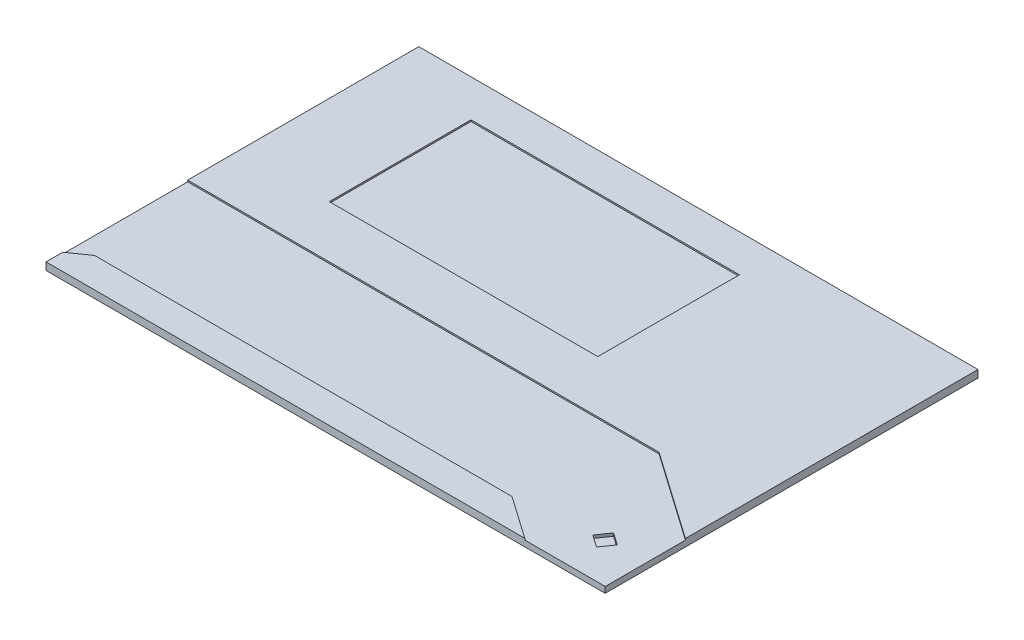
ISO-10303-21;
HEADER;
FILE_DESCRIPTION(('STEP AP214'),'2;1');
FILE_NAME('part.step','',(''),(''),'','','');
FILE_SCHEMA(('AUTOMOTIVE_DESIGN { 1 0 10303 214 1 1 1 1 }'));
ENDSEC;
DATA;
#1=APPLICATION_CONTEXT('core data for automotive mechanical design processes');
#2=APPLICATION_PROTOCOL_DEFINITION('international standard','automotive_design',2000,#1);
#3=PRODUCT_CONTEXT('',#1,'mechanical');
#4=PRODUCT('Part','Part','',(#3));
#5=PRODUCT_RELATED_PRODUCT_CATEGORY('part','',(#4));
#6=PRODUCT_DEFINITION_FORMATION('','',#4);
#7=PRODUCT_DEFINITION_CONTEXT('part definition',#1,'design');
#8=PRODUCT_DEFINITION('design','',#6,#7);
#9=PRODUCT_DEFINITION_SHAPE('','',#8);
#10=(LENGTH_UNIT() NAMED_UNIT(*) SI_UNIT(.MILLI.,.METRE.));
#11=(NAMED_UNIT(*) PLANE_ANGLE_UNIT() SI_UNIT($,.RADIAN.));
#12=(NAMED_UNIT(*) SI_UNIT($,.STERADIAN.) SOLID_ANGLE_UNIT());
#13=UNCERTAINTY_MEASURE_WITH_UNIT(LENGTH_MEASURE(1.E-05),#10,'distance_accuracy_value','');
#14=(GEOMETRIC_REPRESENTATION_CONTEXT(3) GLOBAL_UNCERTAINTY_ASSIGNED_CONTEXT((#13)) GLOBAL_UNIT_ASSIGNED_CONTEXT((#10,
#11,#12)) REPRESENTATION_CONTEXT('',''));
#15=CARTESIAN_POINT('',(0.,0.,0.));
#16=DIRECTION('',(0.,0.,1.));
#17=DIRECTION('',(1.,0.,0.));
#18=AXIS2_PLACEMENT_3D('',#15,#16,#17);
#19=CARTESIAN_POINT('',(0.,-10.,0.));
#20=DIRECTION('',(0.,-1.,0.));
#21=DIRECTION('',(0.,0.,-1.));
#22=AXIS2_PLACEMENT_3D('',#19,#20,#21);
#23=PLANE('',#22);
#24=DIRECTION('',(1.,0.,0.));
#25=VECTOR('',#24,1.);
#26=CARTESIAN_POINT('',(-375.,-10.,250.));
#27=LINE('',#26,#25);
#28=CARTESIAN_POINT('',(-375.,-10.,250.));
#29=VERTEX_POINT('',#28);
#30=CARTESIAN_POINT('',(375.,-10.,250.));
#31=VERTEX_POINT('',#30);
#32=EDGE_CURVE('E452',#29,#31,#27,.T.);
#33=ORIENTED_EDGE('',*,*,#32,.F.);
#34=DIRECTION('',(0.,0.,1.));
#35=VECTOR('',#34,1.);
#36=CARTESIAN_POINT('',(-375.,-10.,-250.));
#37=LINE('',#36,#35);
#38=CARTESIAN_POINT('',(-375.,-10.,-250.));
#39=VERTEX_POINT('',#38);
#40=EDGE_CURVE('E463',#39,#29,#37,.T.);
#41=ORIENTED_EDGE('',*,*,#40,.F.);
#42=DIRECTION('',(1.,0.,0.));
#43=VECTOR('',#42,1.);
#44=CARTESIAN_POINT('',(-375.,-10.,-250.));
#45=LINE('',#44,#43);
#46=CARTESIAN_POINT('',(375.,-10.,-250.));
#47=VERTEX_POINT('',#46);
#48=EDGE_CURVE('E460',#39,#47,#45,.T.);
#49=ORIENTED_EDGE('',*,*,#48,.T.);
#50=DIRECTION('',(0.,0.,1.));
#51=VECTOR('',#50,1.);
#52=CARTESIAN_POINT('',(375.,-10.,-250.));
#53=LINE('',#52,#51);
#54=EDGE_CURVE('E456',#47,#31,#53,.T.);
#55=ORIENTED_EDGE('',*,*,#54,.T.);
#56=EDGE_LOOP('',(#33,#41,#49,#55));
#57=FACE_BOUND('',#56,.T.);
#58=DIRECTION('',(-1.,0.,0.));
#59=VECTOR('',#58,1.);
#60=CARTESIAN_POINT('',(-68.6777851594501,-10.,-68.090467316598));
#61=LINE('',#60,#59);
#62=CARTESIAN_POINT('',(-68.6777851594501,-10.,-68.090467316598));
#63=VERTEX_POINT('',#62);
#64=CARTESIAN_POINT('',(-228.67778515945,-10.,-68.090467316598));
#65=VERTEX_POINT('',#64);
#66=EDGE_CURVE('E827',#63,#65,#61,.T.);
#67=ORIENTED_EDGE('',*,*,#66,.F.);
#68=DIRECTION('',(0.,0.,1.));
#69=VECTOR('',#68,1.);
#70=CARTESIAN_POINT('',(-68.6777851594501,-10.,-107.270941327931));
#71=LINE('',#70,#69);
#72=CARTESIAN_POINT('',(-68.6777851594501,-10.,-120.090467316598));
#73=VERTEX_POINT('',#72);
#74=EDGE_CURVE('E250',#73,#63,#71,.T.);
#75=ORIENTED_EDGE('',*,*,#74,.F.);
#76=DIRECTION('',(1.,0.,0.));
#77=VECTOR('',#76,1.);
#78=CARTESIAN_POINT('',(-68.6777851594501,-10.,-120.090467316598));
#79=LINE('',#78,#77);
#80=CARTESIAN_POINT('',(-228.67778515945,-10.,-120.090467316598));
#81=VERTEX_POINT('',#80);
#82=EDGE_CURVE('E234',#81,#73,#79,.T.);
#83=ORIENTED_EDGE('',*,*,#82,.F.);
#84=DIRECTION('',(0.,0.,-1.));
#85=VECTOR('',#84,1.);
#86=CARTESIAN_POINT('',(-228.67778515945,-10.,-120.090467316598));
#87=LINE('',#86,#85);
#88=EDGE_CURVE('E816',#65,#81,#87,.T.);
#89=ORIENTED_EDGE('',*,*,#88,.F.);
#90=EDGE_LOOP('',(#67,#75,#83,#89));
#91=FACE_BOUND('',#90,.T.);
#92=ADVANCED_FACE('F45',(#57,#91),#23,.T.);
#93=CARTESIAN_POINT('',(0.,0.,0.));
#94=DIRECTION('',(0.,-1.,0.));
#95=DIRECTION('',(0.,0.,-1.));
#96=AXIS2_PLACEMENT_3D('',#93,#94,#95);
#97=PLANE('',#96);
#98=DIRECTION('',(1.,0.,0.));
#99=VECTOR('',#98,1.);
#100=CARTESIAN_POINT('',(-255.,0.,-9.99999999999995));
#101=LINE('',#100,#99);
#102=CARTESIAN_POINT('',(-255.,0.,-9.99999999999995));
#103=VERTEX_POINT('',#102);
#104=CARTESIAN_POINT('',(105.,0.,-9.99999999999995));
#105=VERTEX_POINT('',#104);
#106=EDGE_CURVE('E357',#103,#105,#101,.T.);
#107=ORIENTED_EDGE('',*,*,#106,.F.);
#108=DIRECTION('',(0.,0.,1.));
#109=VECTOR('',#108,1.);
#110=CARTESIAN_POINT('',(-255.,0.,-200.));
#111=LINE('',#110,#109);
#112=CARTESIAN_POINT('',(-255.,0.,-200.));
#113=VERTEX_POINT('',#112);
#114=EDGE_CURVE('E354',#113,#103,#111,.T.);
#115=ORIENTED_EDGE('',*,*,#114,.F.);
#116=DIRECTION('',(-1.,0.,0.));
#117=VECTOR('',#116,1.);
#118=CARTESIAN_POINT('',(-255.,0.,-200.));
#119=LINE('',#118,#117);
#120=CARTESIAN_POINT('',(105.,0.,-200.));
#121=VERTEX_POINT('',#120);
#122=EDGE_CURVE('E341',#121,#113,#119,.T.);
#123=ORIENTED_EDGE('',*,*,#122,.F.);
#124=DIRECTION('',(0.,0.,-1.));
#125=VECTOR('',#124,1.);
#126=CARTESIAN_POINT('',(105.,0.,-200.));
#127=LINE('',#126,#125);
#128=EDGE_CURVE('E362',#105,#121,#127,.T.);
#129=ORIENTED_EDGE('',*,*,#128,.F.);
#130=EDGE_LOOP('',(#107,#115,#123,#129));
#131=FACE_BOUND('',#130,.T.);
#132=DIRECTION('',(0.,0.,1.));
#133=VECTOR('',#132,1.);
#134=CARTESIAN_POINT('',(-375.,0.,-250.));
#135=LINE('',#134,#133);
#136=CARTESIAN_POINT('',(-375.,0.,-250.));
#137=VERTEX_POINT('',#136);
#138=CARTESIAN_POINT('',(-375.,0.,60.0000000000001));
#139=VERTEX_POINT('',#138);
#140=EDGE_CURVE('E457',#137,#139,#135,.T.);
#141=ORIENTED_EDGE('',*,*,#140,.T.);
#142=DIRECTION('',(-1.,0.,0.));
#143=VECTOR('',#142,1.);
#144=CARTESIAN_POINT('',(-350.,0.,60.0000000000001));
#145=LINE('',#144,#143);
#146=CARTESIAN_POINT('',(257.294818331848,0.,60.0000000000001));
#147=VERTEX_POINT('',#146);
#148=EDGE_CURVE('E405',#147,#139,#145,.T.);
#149=ORIENTED_EDGE('',*,*,#148,.F.);
#150=DIRECTION('',(-0.819152044288992,0.,-0.573576436351046));
#151=VECTOR('',#150,1.);
#152=CARTESIAN_POINT('',(257.294818331848,0.,60.0000000000001));
#153=LINE('',#152,#151);
#154=CARTESIAN_POINT('',(375.,0.,142.418055490384));
#155=VERTEX_POINT('',#154);
#156=EDGE_CURVE('E408',#155,#147,#153,.T.);
#157=ORIENTED_EDGE('',*,*,#156,.F.);
#158=DIRECTION('',(0.,0.,1.));
#159=VECTOR('',#158,1.);
#160=CARTESIAN_POINT('',(375.,0.,-250.));
#161=LINE('',#160,#159);
#162=CARTESIAN_POINT('',(375.,0.,-250.));
#163=VERTEX_POINT('',#162);
#164=EDGE_CURVE('E471',#163,#155,#161,.T.);
#165=ORIENTED_EDGE('',*,*,#164,.F.);
#166=DIRECTION('',(1.,0.,0.));
#167=VECTOR('',#166,1.);
#168=CARTESIAN_POINT('',(-375.,0.,-250.));
#169=LINE('',#168,#167);
#170=EDGE_CURVE('E475',#137,#163,#169,.T.);
#171=ORIENTED_EDGE('',*,*,#170,.F.);
#172=EDGE_LOOP('',(#141,#149,#157,#165,#171));
#173=FACE_BOUND('',#172,.T.);
#174=ADVANCED_FACE('F530',(#131,#173),#97,.F.);
#175=CARTESIAN_POINT('',(-375.,-10.,250.));
#176=DIRECTION('',(0.,0.,1.));
#177=DIRECTION('',(1.,0.,0.));
#178=AXIS2_PLACEMENT_3D('',#175,#176,#177);
#179=PLANE('',#178);
#180=DIRECTION('',(0.,1.,0.));
#181=VECTOR('',#180,1.);
#182=CARTESIAN_POINT('',(267.125920269684,-2.,250.));
#183=LINE('',#182,#181);
#184=CARTESIAN_POINT('',(267.125920269684,-2.,250.));
#185=VERTEX_POINT('',#184);
#186=CARTESIAN_POINT('',(267.125920269684,0.,250.));
#187=VERTEX_POINT('',#186);
#188=EDGE_CURVE('E396',#185,#187,#183,.T.);
#189=ORIENTED_EDGE('',*,*,#188,.T.);
#190=DIRECTION('',(1.,0.,0.));
#191=VECTOR('',#190,1.);
#192=CARTESIAN_POINT('',(-375.,0.,250.));
#193=LINE('',#192,#191);
#194=CARTESIAN_POINT('',(-375.,0.,250.));
#195=VERTEX_POINT('',#194);
#196=EDGE_CURVE('E372',#195,#187,#193,.T.);
#197=ORIENTED_EDGE('',*,*,#196,.F.);
#198=DIRECTION('',(0.,1.,0.));
#199=VECTOR('',#198,1.);
#200=CARTESIAN_POINT('',(-375.,-10.,250.));
#201=LINE('',#200,#199);
#202=EDGE_CURVE('E54',#29,#195,#201,.T.);
#203=ORIENTED_EDGE('',*,*,#202,.F.);
#204=ORIENTED_EDGE('',*,*,#32,.T.);
#205=DIRECTION('',(0.,1.,0.));
#206=VECTOR('',#205,1.);
#207=CARTESIAN_POINT('',(375.,-10.,250.));
#208=LINE('',#207,#206);
#209=CARTESIAN_POINT('',(375.,-2.,250.));
#210=VERTEX_POINT('',#209);
#211=EDGE_CURVE('E467',#31,#210,#208,.T.);
#212=ORIENTED_EDGE('',*,*,#211,.T.);
#213=DIRECTION('',(1.,0.,0.));
#214=VECTOR('',#213,1.);
#215=CARTESIAN_POINT('',(267.125920269684,-2.,250.));
#216=LINE('',#215,#214);
#217=EDGE_CURVE('E430',#185,#210,#216,.T.);
#218=ORIENTED_EDGE('',*,*,#217,.F.);
#219=EDGE_LOOP('',(#189,#197,#203,#204,#212,#218));
#220=FACE_BOUND('',#219,.T.);
#221=ADVANCED_FACE('F47',(#220),#179,.T.);
#222=CARTESIAN_POINT('',(-375.,-10.,-250.));
#223=DIRECTION('',(-1.,0.,0.));
#224=DIRECTION('',(0.,0.,1.));
#225=AXIS2_PLACEMENT_3D('',#222,#223,#224);
#226=PLANE('',#225);
#227=DIRECTION('',(0.,1.,0.));
#228=VECTOR('',#227,1.);
#229=CARTESIAN_POINT('',(-375.,-2.,60.0000000000001));
#230=LINE('',#229,#228);
#231=CARTESIAN_POINT('',(-375.,-2.,60.0000000000001));
#232=VERTEX_POINT('',#231);
#233=EDGE_CURVE('E382',#232,#139,#230,.T.);
#234=ORIENTED_EDGE('',*,*,#233,.T.);
#235=ORIENTED_EDGE('',*,*,#140,.F.);
#236=DIRECTION('',(0.,1.,0.));
#237=VECTOR('',#236,1.);
#238=CARTESIAN_POINT('',(-375.,-10.,-250.));
#239=LINE('',#238,#237);
#240=EDGE_CURVE('E485',#39,#137,#239,.T.);
#241=ORIENTED_EDGE('',*,*,#240,.F.);
#242=ORIENTED_EDGE('',*,*,#40,.T.);
#243=ORIENTED_EDGE('',*,*,#202,.T.);
#244=CARTESIAN_POINT('',(-375.,0.,227.505188455243));
#245=VERTEX_POINT('',#244);
#246=EDGE_CURVE('E478',#245,#195,#135,.T.);
#247=ORIENTED_EDGE('',*,*,#246,.F.);
#248=DIRECTION('',(0.,1.,0.));
#249=VECTOR('',#248,1.);
#250=CARTESIAN_POINT('',(-375.,-2.,227.505188455243));
#251=LINE('',#250,#249);
#252=CARTESIAN_POINT('',(-375.,-2.,227.505188455243));
#253=VERTEX_POINT('',#252);
#254=EDGE_CURVE('E387',#253,#245,#251,.T.);
#255=ORIENTED_EDGE('',*,*,#254,.F.);
#256=DIRECTION('',(0.,0.,1.));
#257=VECTOR('',#256,1.);
#258=CARTESIAN_POINT('',(-375.,-2.,60.0000000000001));
#259=LINE('',#258,#257);
#260=EDGE_CURVE('E445',#232,#253,#259,.T.);
#261=ORIENTED_EDGE('',*,*,#260,.F.);
#262=EDGE_LOOP('',(#234,#235,#241,#242,#243,#247,#255,#261));
#263=FACE_BOUND('',#262,.T.);
#264=ADVANCED_FACE('F518',(#263),#226,.T.);
#265=CARTESIAN_POINT('',(-375.,-10.,-250.));
#266=DIRECTION('',(0.,0.,1.));
#267=DIRECTION('',(1.,0.,0.));
#268=AXIS2_PLACEMENT_3D('',#265,#266,#267);
#269=PLANE('',#268);
#270=ORIENTED_EDGE('',*,*,#170,.T.);
#271=DIRECTION('',(0.,1.,0.));
#272=VECTOR('',#271,1.);
#273=CARTESIAN_POINT('',(375.,-10.,-250.));
#274=LINE('',#273,#272);
#275=EDGE_CURVE('E488',#47,#163,#274,.T.);
#276=ORIENTED_EDGE('',*,*,#275,.F.);
#277=ORIENTED_EDGE('',*,*,#48,.F.);
#278=ORIENTED_EDGE('',*,*,#240,.T.);
#279=EDGE_LOOP('',(#270,#276,#277,#278));
#280=FACE_BOUND('',#279,.T.);
#281=ADVANCED_FACE('F525',(#280),#269,.F.);
#282=CARTESIAN_POINT('',(375.,-10.,-250.));
#283=DIRECTION('',(-1.,0.,0.));
#284=DIRECTION('',(0.,0.,1.));
#285=AXIS2_PLACEMENT_3D('',#282,#283,#284);
#286=PLANE('',#285);
#287=ORIENTED_EDGE('',*,*,#164,.T.);
#288=DIRECTION('',(0.,1.,0.));
#289=VECTOR('',#288,1.);
#290=CARTESIAN_POINT('',(375.,-2.,142.418055490384));
#291=LINE('',#290,#289);
#292=CARTESIAN_POINT('',(375.,-2.,142.418055490384));
#293=VERTEX_POINT('',#292);
#294=EDGE_CURVE('E400',#293,#155,#291,.T.);
#295=ORIENTED_EDGE('',*,*,#294,.F.);
#296=DIRECTION('',(0.,0.,-1.));
#297=VECTOR('',#296,1.);
#298=CARTESIAN_POINT('',(375.,-2.,250.));
#299=LINE('',#298,#297);
#300=EDGE_CURVE('E426',#210,#293,#299,.T.);
#301=ORIENTED_EDGE('',*,*,#300,.F.);
#302=ORIENTED_EDGE('',*,*,#211,.F.);
#303=ORIENTED_EDGE('',*,*,#54,.F.);
#304=ORIENTED_EDGE('',*,*,#275,.T.);
#305=EDGE_LOOP('',(#287,#295,#301,#302,#303,#304));
#306=FACE_BOUND('',#305,.T.);
#307=ADVANCED_FACE('F500',(#306),#286,.F.);
#308=ORIENTED_EDGE('',*,*,#196,.T.);
#309=DIRECTION('',(0.819152044288992,0.,0.573576436351046));
#310=VECTOR('',#309,1.);
#311=CARTESIAN_POINT('',(210.,0.,210.));
#312=LINE('',#311,#310);
#313=CARTESIAN_POINT('',(210.,0.,210.));
#314=VERTEX_POINT('',#313);
#315=EDGE_CURVE('E413',#314,#187,#312,.T.);
#316=ORIENTED_EDGE('',*,*,#315,.F.);
#317=DIRECTION('',(1.,0.,0.));
#318=VECTOR('',#317,1.);
#319=CARTESIAN_POINT('',(-350.,0.,210.));
#320=LINE('',#319,#318);
#321=CARTESIAN_POINT('',(-350.,0.,210.));
#322=VERTEX_POINT('',#321);
#323=EDGE_CURVE('E416',#322,#314,#320,.T.);
#324=ORIENTED_EDGE('',*,*,#323,.F.);
#325=DIRECTION('',(0.819152044288996,0.,-0.57357643635104));
#326=VECTOR('',#325,1.);
#327=CARTESIAN_POINT('',(-350.,0.,210.));
#328=LINE('',#327,#326);
#329=EDGE_CURVE('E358',#245,#322,#328,.T.);
#330=ORIENTED_EDGE('',*,*,#329,.F.);
#331=ORIENTED_EDGE('',*,*,#246,.T.);
#332=EDGE_LOOP('',(#308,#316,#324,#330,#331));
#333=FACE_BOUND('',#332,.T.);
#334=ADVANCED_FACE('F511',(#333),#97,.F.);
#335=CARTESIAN_POINT('',(-350.,-2.,60.0000000000001));
#336=DIRECTION('',(0.,0.,-1.));
#337=DIRECTION('',(-1.,0.,0.));
#338=AXIS2_PLACEMENT_3D('',#335,#336,#337);
#339=PLANE('',#338);
#340=ORIENTED_EDGE('',*,*,#148,.T.);
#341=ORIENTED_EDGE('',*,*,#233,.F.);
#342=DIRECTION('',(-1.,0.,0.));
#343=VECTOR('',#342,1.);
#344=CARTESIAN_POINT('',(-350.,-2.,60.0000000000001));
#345=LINE('',#344,#343);
#346=CARTESIAN_POINT('',(257.294818331848,-2.,60.0000000000001));
#347=VERTEX_POINT('',#346);
#348=EDGE_CURVE('E409',#347,#232,#345,.T.);
#349=ORIENTED_EDGE('',*,*,#348,.F.);
#350=DIRECTION('',(0.,1.,0.));
#351=VECTOR('',#350,1.);
#352=CARTESIAN_POINT('',(257.294818331848,-2.,60.0000000000001));
#353=LINE('',#352,#351);
#354=EDGE_CURVE('E327',#347,#147,#353,.T.);
#355=ORIENTED_EDGE('',*,*,#354,.T.);
#356=EDGE_LOOP('',(#340,#341,#349,#355));
#357=FACE_BOUND('',#356,.T.);
#358=ADVANCED_FACE('F537',(#357),#339,.F.);
#359=CARTESIAN_POINT('',(257.294818331848,-2.,60.0000000000001));
#360=DIRECTION('',(0.573576436351046,0.,-0.819152044288992));
#361=DIRECTION('',(-0.819152044288992,0.,-0.573576436351046));
#362=AXIS2_PLACEMENT_3D('',#359,#360,#361);
#363=PLANE('',#362);
#364=ORIENTED_EDGE('',*,*,#156,.T.);
#365=ORIENTED_EDGE('',*,*,#354,.F.);
#366=DIRECTION('',(-0.819152044288992,0.,-0.573576436351046));
#367=VECTOR('',#366,1.);
#368=CARTESIAN_POINT('',(257.294818331848,-2.,60.0000000000001));
#369=LINE('',#368,#367);
#370=EDGE_CURVE('E386',#293,#347,#369,.T.);
#371=ORIENTED_EDGE('',*,*,#370,.F.);
#372=ORIENTED_EDGE('',*,*,#294,.T.);
#373=EDGE_LOOP('',(#364,#365,#371,#372));
#374=FACE_BOUND('',#373,.T.);
#375=ADVANCED_FACE('F535',(#374),#363,.F.);
#376=CARTESIAN_POINT('',(210.,-2.,210.));
#377=DIRECTION('',(-0.573576436351046,0.,0.819152044288992));
#378=DIRECTION('',(0.819152044288992,0.,0.573576436351046));
#379=AXIS2_PLACEMENT_3D('',#376,#377,#378);
#380=PLANE('',#379);
#381=ORIENTED_EDGE('',*,*,#315,.T.);
#382=ORIENTED_EDGE('',*,*,#188,.F.);
#383=DIRECTION('',(0.819152044288992,0.,0.573576436351046));
#384=VECTOR('',#383,1.);
#385=CARTESIAN_POINT('',(210.,-2.,210.));
#386=LINE('',#385,#384);
#387=CARTESIAN_POINT('',(210.,-2.,210.));
#388=VERTEX_POINT('',#387);
#389=EDGE_CURVE('E433',#388,#185,#386,.T.);
#390=ORIENTED_EDGE('',*,*,#389,.F.);
#391=DIRECTION('',(0.,1.,0.));
#392=VECTOR('',#391,1.);
#393=CARTESIAN_POINT('',(210.,-2.,210.));
#394=LINE('',#393,#392);
#395=EDGE_CURVE('E393',#388,#314,#394,.T.);
#396=ORIENTED_EDGE('',*,*,#395,.T.);
#397=EDGE_LOOP('',(#381,#382,#390,#396));
#398=FACE_BOUND('',#397,.T.);
#399=ADVANCED_FACE('F507',(#398),#380,.F.);
#400=CARTESIAN_POINT('',(-350.,-2.,210.));
#401=DIRECTION('',(0.,0.,1.));
#402=DIRECTION('',(1.,0.,0.));
#403=AXIS2_PLACEMENT_3D('',#400,#401,#402);
#404=PLANE('',#403);
#405=ORIENTED_EDGE('',*,*,#323,.T.);
#406=ORIENTED_EDGE('',*,*,#395,.F.);
#407=DIRECTION('',(1.,0.,0.));
#408=VECTOR('',#407,1.);
#409=CARTESIAN_POINT('',(-350.,-2.,210.));
#410=LINE('',#409,#408);
#411=CARTESIAN_POINT('',(-350.,-2.,210.));
#412=VERTEX_POINT('',#411);
#413=EDGE_CURVE('E437',#412,#388,#410,.T.);
#414=ORIENTED_EDGE('',*,*,#413,.F.);
#415=DIRECTION('',(0.,1.,0.));
#416=VECTOR('',#415,1.);
#417=CARTESIAN_POINT('',(-350.,-2.,210.));
#418=LINE('',#417,#416);
#419=EDGE_CURVE('E390',#412,#322,#418,.T.);
#420=ORIENTED_EDGE('',*,*,#419,.T.);
#421=EDGE_LOOP('',(#405,#406,#414,#420));
#422=FACE_BOUND('',#421,.T.);
#423=ADVANCED_FACE('F542',(#422),#404,.F.);
#424=CARTESIAN_POINT('',(-350.,-2.,210.));
#425=DIRECTION('',(0.57357643635104,0.,0.819152044288996));
#426=DIRECTION('',(0.819152044288996,0.,-0.57357643635104));
#427=AXIS2_PLACEMENT_3D('',#424,#425,#426);
#428=PLANE('',#427);
#429=ORIENTED_EDGE('',*,*,#329,.T.);
#430=ORIENTED_EDGE('',*,*,#419,.F.);
#431=DIRECTION('',(0.819152044288996,0.,-0.57357643635104));
#432=VECTOR('',#431,1.);
#433=CARTESIAN_POINT('',(-350.,-2.,210.));
#434=LINE('',#433,#432);
#435=EDGE_CURVE('E441',#253,#412,#434,.T.);
#436=ORIENTED_EDGE('',*,*,#435,.F.);
#437=ORIENTED_EDGE('',*,*,#254,.T.);
#438=EDGE_LOOP('',(#429,#430,#436,#437));
#439=FACE_BOUND('',#438,.T.);
#440=ADVANCED_FACE('F540',(#439),#428,.F.);
#441=CARTESIAN_POINT('',(0.,-2.,0.));
#442=DIRECTION('',(0.,1.,0.));
#443=DIRECTION('',(0.,0.,1.));
#444=AXIS2_PLACEMENT_3D('',#441,#442,#443);
#445=PLANE('',#444);
#446=DIRECTION('',(-0.573576436351044,0.,0.819152044288993));
#447=VECTOR('',#446,1.);
#448=CARTESIAN_POINT('',(318.412529556612,-2.,182.145430387199));
#449=LINE('',#448,#447);
#450=CARTESIAN_POINT('',(318.412529556612,-2.,182.145430387199));
#451=VERTEX_POINT('',#450);
#452=CARTESIAN_POINT('',(306.941000829591,-2.,198.528471272979));
#453=VERTEX_POINT('',#452);
#454=EDGE_CURVE('E68',#451,#453,#449,.T.);
#455=ORIENTED_EDGE('',*,*,#454,.F.);
#456=DIRECTION('',(-0.819152044288992,0.,-0.573576436351046));
#457=VECTOR('',#456,1.);
#458=CARTESIAN_POINT('',(318.412529556612,-2.,182.145430387199));
#459=LINE('',#458,#457);
#460=CARTESIAN_POINT('',(334.795570442392,-2.,193.61695911422));
#461=VERTEX_POINT('',#460);
#462=EDGE_CURVE('E298',#461,#451,#459,.T.);
#463=ORIENTED_EDGE('',*,*,#462,.F.);
#464=DIRECTION('',(0.573576436351047,0.,-0.819152044288991));
#465=VECTOR('',#464,1.);
#466=CARTESIAN_POINT('',(334.795570442392,-2.,193.61695911422));
#467=LINE('',#466,#465);
#468=CARTESIAN_POINT('',(323.324041715371,-2.,210.));
#469=VERTEX_POINT('',#468);
#470=EDGE_CURVE('E317',#469,#461,#467,.T.);
#471=ORIENTED_EDGE('',*,*,#470,.F.);
#472=DIRECTION('',(0.819152044288992,0.,0.573576436351046));
#473=VECTOR('',#472,1.);
#474=CARTESIAN_POINT('',(306.941000829591,-2.,198.528471272979));
#475=LINE('',#474,#473);
#476=EDGE_CURVE('E313',#453,#469,#475,.T.);
#477=ORIENTED_EDGE('',*,*,#476,.F.);
#478=EDGE_LOOP('',(#455,#463,#471,#477));
#479=FACE_BOUND('',#478,.T.);
#480=ORIENTED_EDGE('',*,*,#348,.T.);
#481=ORIENTED_EDGE('',*,*,#260,.T.);
#482=ORIENTED_EDGE('',*,*,#435,.T.);
#483=ORIENTED_EDGE('',*,*,#413,.T.);
#484=ORIENTED_EDGE('',*,*,#389,.T.);
#485=ORIENTED_EDGE('',*,*,#217,.T.);
#486=ORIENTED_EDGE('',*,*,#300,.T.);
#487=ORIENTED_EDGE('',*,*,#370,.T.);
#488=EDGE_LOOP('',(#480,#481,#482,#483,#484,#485,#486,#487));
#489=FACE_BOUND('',#488,.T.);
#490=ADVANCED_FACE('F503',(#479,#489),#445,.T.);
#491=CARTESIAN_POINT('',(-255.,-2.,-200.));
#492=DIRECTION('',(-1.,0.,0.));
#493=DIRECTION('',(0.,0.,1.));
#494=AXIS2_PLACEMENT_3D('',#491,#492,#493);
#495=PLANE('',#494);
#496=ORIENTED_EDGE('',*,*,#114,.T.);
#497=DIRECTION('',(0.,1.,0.));
#498=VECTOR('',#497,1.);
#499=CARTESIAN_POINT('',(-255.,-2.,-9.99999999999995));
#500=LINE('',#499,#498);
#501=CARTESIAN_POINT('',(-255.,-2.,-9.99999999999995));
#502=VERTEX_POINT('',#501);
#503=EDGE_CURVE('E353',#502,#103,#500,.T.);
#504=ORIENTED_EDGE('',*,*,#503,.F.);
#505=DIRECTION('',(0.,0.,1.));
#506=VECTOR('',#505,1.);
#507=CARTESIAN_POINT('',(-255.,-2.,-200.));
#508=LINE('',#507,#506);
#509=CARTESIAN_POINT('',(-255.,-2.,-200.));
#510=VERTEX_POINT('',#509);
#511=EDGE_CURVE('E336',#510,#502,#508,.T.);
#512=ORIENTED_EDGE('',*,*,#511,.F.);
#513=DIRECTION('',(0.,1.,0.));
#514=VECTOR('',#513,1.);
#515=CARTESIAN_POINT('',(-255.,-2.,-200.));
#516=LINE('',#515,#514);
#517=EDGE_CURVE('E369',#510,#113,#516,.T.);
#518=ORIENTED_EDGE('',*,*,#517,.T.);
#519=EDGE_LOOP('',(#496,#504,#512,#518));
#520=FACE_BOUND('',#519,.T.);
#521=ADVANCED_FACE('F619',(#520),#495,.F.);
#522=CARTESIAN_POINT('',(-255.,-2.,-200.));
#523=DIRECTION('',(0.,0.,-1.));
#524=DIRECTION('',(-1.,0.,0.));
#525=AXIS2_PLACEMENT_3D('',#522,#523,#524);
#526=PLANE('',#525);
#527=ORIENTED_EDGE('',*,*,#122,.T.);
#528=ORIENTED_EDGE('',*,*,#517,.F.);
#529=DIRECTION('',(-1.,0.,0.));
#530=VECTOR('',#529,1.);
#531=CARTESIAN_POINT('',(-255.,-2.,-200.));
#532=LINE('',#531,#530);
#533=CARTESIAN_POINT('',(105.,-2.,-200.));
#534=VERTEX_POINT('',#533);
#535=EDGE_CURVE('E349',#534,#510,#532,.T.);
#536=ORIENTED_EDGE('',*,*,#535,.F.);
#537=DIRECTION('',(0.,1.,0.));
#538=VECTOR('',#537,1.);
#539=CARTESIAN_POINT('',(105.,-2.,-200.));
#540=LINE('',#539,#538);
#541=EDGE_CURVE('E373',#534,#121,#540,.T.);
#542=ORIENTED_EDGE('',*,*,#541,.T.);
#543=EDGE_LOOP('',(#527,#528,#536,#542));
#544=FACE_BOUND('',#543,.T.);
#545=ADVANCED_FACE('F629',(#544),#526,.F.);
#546=CARTESIAN_POINT('',(105.,-2.,-200.));
#547=DIRECTION('',(1.,0.,0.));
#548=DIRECTION('',(0.,0.,-1.));
#549=AXIS2_PLACEMENT_3D('',#546,#547,#548);
#550=PLANE('',#549);
#551=ORIENTED_EDGE('',*,*,#128,.T.);
#552=ORIENTED_EDGE('',*,*,#541,.F.);
#553=DIRECTION('',(0.,0.,-1.));
#554=VECTOR('',#553,1.);
#555=CARTESIAN_POINT('',(105.,-2.,-200.));
#556=LINE('',#555,#554);
#557=CARTESIAN_POINT('',(105.,-2.,-9.99999999999995));
#558=VERTEX_POINT('',#557);
#559=EDGE_CURVE('E345',#558,#534,#556,.T.);
#560=ORIENTED_EDGE('',*,*,#559,.F.);
#561=DIRECTION('',(0.,1.,0.));
#562=VECTOR('',#561,1.);
#563=CARTESIAN_POINT('',(105.,-2.,-9.99999999999995));
#564=LINE('',#563,#562);
#565=EDGE_CURVE('E376',#558,#105,#564,.T.);
#566=ORIENTED_EDGE('',*,*,#565,.T.);
#567=EDGE_LOOP('',(#551,#552,#560,#566));
#568=FACE_BOUND('',#567,.T.);
#569=ADVANCED_FACE('F639',(#568),#550,.F.);
#570=CARTESIAN_POINT('',(-255.,-2.,-9.99999999999995));
#571=DIRECTION('',(0.,0.,1.));
#572=DIRECTION('',(1.,0.,0.));
#573=AXIS2_PLACEMENT_3D('',#570,#571,#572);
#574=PLANE('',#573);
#575=ORIENTED_EDGE('',*,*,#106,.T.);
#576=ORIENTED_EDGE('',*,*,#565,.F.);
#577=DIRECTION('',(1.,0.,0.));
#578=VECTOR('',#577,1.);
#579=CARTESIAN_POINT('',(-255.,-2.,-9.99999999999995));
#580=LINE('',#579,#578);
#581=EDGE_CURVE('E340',#502,#558,#580,.T.);
#582=ORIENTED_EDGE('',*,*,#581,.F.);
#583=ORIENTED_EDGE('',*,*,#503,.T.);
#584=EDGE_LOOP('',(#575,#576,#582,#583));
#585=FACE_BOUND('',#584,.T.);
#586=ADVANCED_FACE('F649',(#585),#574,.F.);
#587=CARTESIAN_POINT('',(0.,-2.,0.));
#588=DIRECTION('',(0.,1.,0.));
#589=DIRECTION('',(0.,0.,1.));
#590=AXIS2_PLACEMENT_3D('',#587,#588,#589);
#591=PLANE('',#590);
#592=ORIENTED_EDGE('',*,*,#511,.T.);
#593=ORIENTED_EDGE('',*,*,#581,.T.);
#594=ORIENTED_EDGE('',*,*,#559,.T.);
#595=ORIENTED_EDGE('',*,*,#535,.T.);
#596=EDGE_LOOP('',(#592,#593,#594,#595));
#597=FACE_BOUND('',#596,.T.);
#598=ADVANCED_FACE('F659',(#597),#591,.T.);
#599=CARTESIAN_POINT('',(318.412529556612,-6.,182.145430387199));
#600=DIRECTION('',(-0.819152044288993,0.,-0.573576436351044));
#601=DIRECTION('',(-0.573576436351044,0.,0.819152044288993));
#602=AXIS2_PLACEMENT_3D('',#599,#600,#601);
#603=PLANE('',#602);
#604=ORIENTED_EDGE('',*,*,#454,.T.);
#605=DIRECTION('',(0.,1.,0.));
#606=VECTOR('',#605,1.);
#607=CARTESIAN_POINT('',(306.941000829591,-6.,198.528471272979));
#608=LINE('',#607,#606);
#609=CARTESIAN_POINT('',(306.941000829591,-6.,198.528471272979));
#610=VERTEX_POINT('',#609);
#611=EDGE_CURVE('E310',#610,#453,#608,.T.);
#612=ORIENTED_EDGE('',*,*,#611,.F.);
#613=DIRECTION('',(-0.573576436351044,0.,0.819152044288993));
#614=VECTOR('',#613,1.);
#615=CARTESIAN_POINT('',(318.412529556612,-6.,182.145430387199));
#616=LINE('',#615,#614);
#617=CARTESIAN_POINT('',(318.412529556612,-6.,182.145430387199));
#618=VERTEX_POINT('',#617);
#619=EDGE_CURVE('E293',#618,#610,#616,.T.);
#620=ORIENTED_EDGE('',*,*,#619,.F.);
#621=DIRECTION('',(0.,1.,0.));
#622=VECTOR('',#621,1.);
#623=CARTESIAN_POINT('',(318.412529556612,-6.,182.145430387199));
#624=LINE('',#623,#622);
#625=EDGE_CURVE('E324',#618,#451,#624,.T.);
#626=ORIENTED_EDGE('',*,*,#625,.T.);
#627=EDGE_LOOP('',(#604,#612,#620,#626));
#628=FACE_BOUND('',#627,.T.);
#629=ADVANCED_FACE('F668',(#628),#603,.F.);
#630=CARTESIAN_POINT('',(318.412529556612,-6.,182.145430387199));
#631=DIRECTION('',(0.573576436351046,0.,-0.819152044288992));
#632=DIRECTION('',(-0.819152044288992,0.,-0.573576436351046));
#633=AXIS2_PLACEMENT_3D('',#630,#631,#632);
#634=PLANE('',#633);
#635=ORIENTED_EDGE('',*,*,#462,.T.);
#636=ORIENTED_EDGE('',*,*,#625,.F.);
#637=DIRECTION('',(-0.819152044288992,0.,-0.573576436351046));
#638=VECTOR('',#637,1.);
#639=CARTESIAN_POINT('',(318.412529556612,-6.,182.145430387199));
#640=LINE('',#639,#638);
#641=CARTESIAN_POINT('',(334.795570442392,-6.,193.61695911422));
#642=VERTEX_POINT('',#641);
#643=EDGE_CURVE('E306',#642,#618,#640,.T.);
#644=ORIENTED_EDGE('',*,*,#643,.F.);
#645=DIRECTION('',(0.,1.,0.));
#646=VECTOR('',#645,1.);
#647=CARTESIAN_POINT('',(334.795570442392,-6.,193.61695911422));
#648=LINE('',#647,#646);
#649=EDGE_CURVE('E328',#642,#461,#648,.T.);
#650=ORIENTED_EDGE('',*,*,#649,.T.);
#651=EDGE_LOOP('',(#635,#636,#644,#650));
#652=FACE_BOUND('',#651,.T.);
#653=ADVANCED_FACE('F677',(#652),#634,.F.);
#654=CARTESIAN_POINT('',(334.795570442392,-6.,193.61695911422));
#655=DIRECTION('',(0.819152044288991,0.,0.573576436351047));
#656=DIRECTION('',(0.573576436351047,0.,-0.819152044288991));
#657=AXIS2_PLACEMENT_3D('',#654,#655,#656);
#658=PLANE('',#657);
#659=ORIENTED_EDGE('',*,*,#470,.T.);
#660=ORIENTED_EDGE('',*,*,#649,.F.);
#661=DIRECTION('',(0.573576436351047,0.,-0.819152044288991));
#662=VECTOR('',#661,1.);
#663=CARTESIAN_POINT('',(334.795570442392,-6.,193.61695911422));
#664=LINE('',#663,#662);
#665=CARTESIAN_POINT('',(323.324041715371,-6.,210.));
#666=VERTEX_POINT('',#665);
#667=EDGE_CURVE('E302',#666,#642,#664,.T.);
#668=ORIENTED_EDGE('',*,*,#667,.F.);
#669=DIRECTION('',(0.,1.,0.));
#670=VECTOR('',#669,1.);
#671=CARTESIAN_POINT('',(323.324041715371,-6.,210.));
#672=LINE('',#671,#670);
#673=EDGE_CURVE('E331',#666,#469,#672,.T.);
#674=ORIENTED_EDGE('',*,*,#673,.T.);
#675=EDGE_LOOP('',(#659,#660,#668,#674));
#676=FACE_BOUND('',#675,.T.);
#677=ADVANCED_FACE('F686',(#676),#658,.F.);
#678=CARTESIAN_POINT('',(306.941000829591,-6.,198.528471272979));
#679=DIRECTION('',(-0.573576436351046,0.,0.819152044288992));
#680=DIRECTION('',(0.819152044288992,0.,0.573576436351046));
#681=AXIS2_PLACEMENT_3D('',#678,#679,#680);
#682=PLANE('',#681);
#683=ORIENTED_EDGE('',*,*,#476,.T.);
#684=ORIENTED_EDGE('',*,*,#673,.F.);
#685=DIRECTION('',(0.819152044288992,0.,0.573576436351046));
#686=VECTOR('',#685,1.);
#687=CARTESIAN_POINT('',(306.941000829591,-6.,198.528471272979));
#688=LINE('',#687,#686);
#689=EDGE_CURVE('E297',#610,#666,#688,.T.);
#690=ORIENTED_EDGE('',*,*,#689,.F.);
#691=ORIENTED_EDGE('',*,*,#611,.T.);
#692=EDGE_LOOP('',(#683,#684,#690,#691));
#693=FACE_BOUND('',#692,.T.);
#694=ADVANCED_FACE('F696',(#693),#682,.F.);
#695=CARTESIAN_POINT('',(0.,-6.,0.));
#696=DIRECTION('',(0.,1.,0.));
#697=DIRECTION('',(0.,0.,1.));
#698=AXIS2_PLACEMENT_3D('',#695,#696,#697);
#699=PLANE('',#698);
#700=ORIENTED_EDGE('',*,*,#619,.T.);
#701=ORIENTED_EDGE('',*,*,#689,.T.);
#702=ORIENTED_EDGE('',*,*,#667,.T.);
#703=ORIENTED_EDGE('',*,*,#643,.T.);
#704=EDGE_LOOP('',(#700,#701,#702,#703));
#705=FACE_BOUND('',#704,.T.);
#706=ADVANCED_FACE('F706',(#705),#699,.T.);
#707=CARTESIAN_POINT('',(-68.6777851594501,-25.,-107.270941327931));
#708=DIRECTION('',(-1.,0.,0.));
#709=DIRECTION('',(0.,0.,1.));
#710=AXIS2_PLACEMENT_3D('',#707,#708,#709);
#711=PLANE('',#710);
#712=DIRECTION('',(0.,1.,0.));
#713=VECTOR('',#712,1.);
#714=CARTESIAN_POINT('',(-68.6777851594501,-25.,-107.270941327931));
#715=LINE('',#714,#713);
#716=CARTESIAN_POINT('',(-68.6777851594501,-25.,-107.270941327931));
#717=VERTEX_POINT('',#716);
#718=CARTESIAN_POINT('',(-68.6777851594501,-20.,-107.270941327931));
#719=VERTEX_POINT('',#718);
#720=EDGE_CURVE('E277',#717,#719,#715,.T.);
#721=ORIENTED_EDGE('',*,*,#720,.T.);
#722=DIRECTION('',(0.,0.,1.));
#723=VECTOR('',#722,1.);
#724=CARTESIAN_POINT('',(-68.6777851594501,-20.,-120.090467316598));
#725=LINE('',#724,#723);
#726=CARTESIAN_POINT('',(-68.6777851594501,-20.,-120.090467316598));
#727=VERTEX_POINT('',#726);
#728=EDGE_CURVE('E61',#727,#719,#725,.T.);
#729=ORIENTED_EDGE('',*,*,#728,.F.);
#730=DIRECTION('',(0.,1.,0.));
#731=VECTOR('',#730,1.);
#732=CARTESIAN_POINT('',(-68.6777851594501,-20.,-120.090467316598));
#733=LINE('',#732,#731);
#734=EDGE_CURVE('E812',#727,#73,#733,.T.);
#735=ORIENTED_EDGE('',*,*,#734,.T.);
#736=ORIENTED_EDGE('',*,*,#74,.T.);
#737=DIRECTION('',(0.,1.,0.));
#738=VECTOR('',#737,1.);
#739=CARTESIAN_POINT('',(-68.6777851594501,-20.,-68.090467316598));
#740=LINE('',#739,#738);
#741=CARTESIAN_POINT('',(-68.6777851594501,-20.,-68.090467316598));
#742=VERTEX_POINT('',#741);
#743=EDGE_CURVE('E239',#742,#63,#740,.T.);
#744=ORIENTED_EDGE('',*,*,#743,.F.);
#745=CARTESIAN_POINT('',(-68.6777851594501,-20.,-80.9099933052646));
#746=VERTEX_POINT('',#745);
#747=EDGE_CURVE('E222',#746,#742,#725,.T.);
#748=ORIENTED_EDGE('',*,*,#747,.F.);
#749=DIRECTION('',(0.,1.,0.));
#750=VECTOR('',#749,1.);
#751=CARTESIAN_POINT('',(-68.6777851594501,-25.,-80.9099933052646));
#752=LINE('',#751,#750);
#753=CARTESIAN_POINT('',(-68.6777851594501,-25.,-80.9099933052646));
#754=VERTEX_POINT('',#753);
#755=EDGE_CURVE('E290',#754,#746,#752,.T.);
#756=ORIENTED_EDGE('',*,*,#755,.F.);
#757=DIRECTION('',(0.,0.,1.));
#758=VECTOR('',#757,1.);
#759=CARTESIAN_POINT('',(-68.6777851594501,-25.,-107.270941327931));
#760=LINE('',#759,#758);
#761=EDGE_CURVE('E264',#717,#754,#760,.T.);
#762=ORIENTED_EDGE('',*,*,#761,.F.);
#763=EDGE_LOOP('',(#721,#729,#735,#736,#744,#748,#756,#762));
#764=FACE_BOUND('',#763,.T.);
#765=ADVANCED_FACE('F248',(#764),#711,.F.);
#766=CARTESIAN_POINT('',(-68.6777851594501,-25.,-80.9099933052646));
#767=DIRECTION('',(0.,0.,-1.));
#768=DIRECTION('',(-1.,0.,0.));
#769=AXIS2_PLACEMENT_3D('',#766,#767,#768);
#770=PLANE('',#769);
#771=ORIENTED_EDGE('',*,*,#755,.T.);
#772=DIRECTION('',(-1.,0.,0.));
#773=VECTOR('',#772,1.);
#774=CARTESIAN_POINT('',(-68.6777851594501,-20.,-80.9099933052646));
#775=LINE('',#774,#773);
#776=CARTESIAN_POINT('',(-118.67778515945,-20.,-80.9099933052646));
#777=VERTEX_POINT('',#776);
#778=EDGE_CURVE('E228',#746,#777,#775,.T.);
#779=ORIENTED_EDGE('',*,*,#778,.T.);
#780=DIRECTION('',(0.,1.,0.));
#781=VECTOR('',#780,1.);
#782=CARTESIAN_POINT('',(-118.67778515945,-25.,-80.9099933052646));
#783=LINE('',#782,#781);
#784=CARTESIAN_POINT('',(-118.67778515945,-25.,-80.9099933052646));
#785=VERTEX_POINT('',#784);
#786=EDGE_CURVE('E286',#785,#777,#783,.T.);
#787=ORIENTED_EDGE('',*,*,#786,.F.);
#788=DIRECTION('',(-1.,0.,0.));
#789=VECTOR('',#788,1.);
#790=CARTESIAN_POINT('',(-68.6777851594501,-25.,-80.9099933052646));
#791=LINE('',#790,#789);
#792=EDGE_CURVE('E268',#754,#785,#791,.T.);
#793=ORIENTED_EDGE('',*,*,#792,.F.);
#794=EDGE_LOOP('',(#771,#779,#787,#793));
#795=FACE_BOUND('',#794,.T.);
#796=ADVANCED_FACE('F725',(#795),#770,.F.);
#797=CARTESIAN_POINT('',(-118.67778515945,-25.,-107.270941327931));
#798=DIRECTION('',(1.,0.,0.));
#799=DIRECTION('',(0.,0.,-1.));
#800=AXIS2_PLACEMENT_3D('',#797,#798,#799);
#801=PLANE('',#800);
#802=ORIENTED_EDGE('',*,*,#786,.T.);
#803=DIRECTION('',(0.,0.,-1.));
#804=VECTOR('',#803,1.);
#805=CARTESIAN_POINT('',(-118.67778515945,-20.,-107.270941327931));
#806=LINE('',#805,#804);
#807=CARTESIAN_POINT('',(-118.67778515945,-20.,-107.270941327931));
#808=VERTEX_POINT('',#807);
#809=EDGE_CURVE('E252',#777,#808,#806,.T.);
#810=ORIENTED_EDGE('',*,*,#809,.T.);
#811=DIRECTION('',(0.,1.,0.));
#812=VECTOR('',#811,1.);
#813=CARTESIAN_POINT('',(-118.67778515945,-25.,-107.270941327931));
#814=LINE('',#813,#812);
#815=CARTESIAN_POINT('',(-118.67778515945,-25.,-107.270941327931));
#816=VERTEX_POINT('',#815);
#817=EDGE_CURVE('E282',#816,#808,#814,.T.);
#818=ORIENTED_EDGE('',*,*,#817,.F.);
#819=DIRECTION('',(0.,0.,-1.));
#820=VECTOR('',#819,1.);
#821=CARTESIAN_POINT('',(-118.67778515945,-25.,-107.270941327931));
#822=LINE('',#821,#820);
#823=EDGE_CURVE('E271',#785,#816,#822,.T.);
#824=ORIENTED_EDGE('',*,*,#823,.F.);
#825=EDGE_LOOP('',(#802,#810,#818,#824));
#826=FACE_BOUND('',#825,.T.);
#827=ADVANCED_FACE('F736',(#826),#801,.F.);
#828=CARTESIAN_POINT('',(-68.6777851594501,-25.,-107.270941327931));
#829=DIRECTION('',(0.,0.,1.));
#830=DIRECTION('',(1.,0.,0.));
#831=AXIS2_PLACEMENT_3D('',#828,#829,#830);
#832=PLANE('',#831);
#833=ORIENTED_EDGE('',*,*,#817,.T.);
#834=DIRECTION('',(1.,0.,0.));
#835=VECTOR('',#834,1.);
#836=CARTESIAN_POINT('',(-68.6777851594501,-20.,-107.270941327931));
#837=LINE('',#836,#835);
#838=EDGE_CURVE('E11',#808,#719,#837,.T.);
#839=ORIENTED_EDGE('',*,*,#838,.T.);
#840=ORIENTED_EDGE('',*,*,#720,.F.);
#841=DIRECTION('',(1.,0.,0.));
#842=VECTOR('',#841,1.);
#843=CARTESIAN_POINT('',(-68.6777851594501,-25.,-107.270941327931));
#844=LINE('',#843,#842);
#845=EDGE_CURVE('E274',#816,#717,#844,.T.);
#846=ORIENTED_EDGE('',*,*,#845,.F.);
#847=EDGE_LOOP('',(#833,#839,#840,#846));
#848=FACE_BOUND('',#847,.T.);
#849=ADVANCED_FACE('F746',(#848),#832,.F.);
#850=CARTESIAN_POINT('',(0.,-25.,0.));
#851=DIRECTION('',(0.,-1.,0.));
#852=DIRECTION('',(0.,0.,-1.));
#853=AXIS2_PLACEMENT_3D('',#850,#851,#852);
#854=PLANE('',#853);
#855=ORIENTED_EDGE('',*,*,#761,.T.);
#856=ORIENTED_EDGE('',*,*,#792,.T.);
#857=ORIENTED_EDGE('',*,*,#823,.T.);
#858=ORIENTED_EDGE('',*,*,#845,.T.);
#859=EDGE_LOOP('',(#855,#856,#857,#858));
#860=FACE_BOUND('',#859,.T.);
#861=ADVANCED_FACE('F756',(#860),#854,.T.);
#862=CARTESIAN_POINT('',(0.,-20.,0.));
#863=DIRECTION('',(0.,-1.,0.));
#864=DIRECTION('',(0.,0.,-1.));
#865=AXIS2_PLACEMENT_3D('',#862,#863,#864);
#866=PLANE('',#865);
#867=ORIENTED_EDGE('',*,*,#778,.F.);
#868=ORIENTED_EDGE('',*,*,#747,.T.);
#869=DIRECTION('',(-1.,0.,0.));
#870=VECTOR('',#869,1.);
#871=CARTESIAN_POINT('',(-68.6777851594501,-20.,-68.090467316598));
#872=LINE('',#871,#870);
#873=CARTESIAN_POINT('',(-228.67778515945,-20.,-68.090467316598));
#874=VERTEX_POINT('',#873);
#875=EDGE_CURVE('E225',#742,#874,#872,.T.);
#876=ORIENTED_EDGE('',*,*,#875,.T.);
#877=DIRECTION('',(0.,0.,-1.));
#878=VECTOR('',#877,1.);
#879=CARTESIAN_POINT('',(-228.67778515945,-20.,-120.090467316598));
#880=LINE('',#879,#878);
#881=CARTESIAN_POINT('',(-228.67778515945,-20.,-120.090467316598));
#882=VERTEX_POINT('',#881);
#883=EDGE_CURVE('E245',#874,#882,#880,.T.);
#884=ORIENTED_EDGE('',*,*,#883,.T.);
#885=DIRECTION('',(1.,0.,0.));
#886=VECTOR('',#885,1.);
#887=CARTESIAN_POINT('',(-68.6777851594501,-20.,-120.090467316598));
#888=LINE('',#887,#886);
#889=EDGE_CURVE('E819',#882,#727,#888,.T.);
#890=ORIENTED_EDGE('',*,*,#889,.T.);
#891=ORIENTED_EDGE('',*,*,#728,.T.);
#892=ORIENTED_EDGE('',*,*,#838,.F.);
#893=ORIENTED_EDGE('',*,*,#809,.F.);
#894=EDGE_LOOP('',(#867,#868,#876,#884,#890,#891,#892,#893));
#895=FACE_BOUND('',#894,.T.);
#896=ADVANCED_FACE('F224',(#895),#866,.T.);
#897=CARTESIAN_POINT('',(-68.6777851594501,-20.,-68.090467316598));
#898=DIRECTION('',(0.,0.,-1.));
#899=DIRECTION('',(-1.,0.,0.));
#900=AXIS2_PLACEMENT_3D('',#897,#898,#899);
#901=PLANE('',#900);
#902=ORIENTED_EDGE('',*,*,#66,.T.);
#903=DIRECTION('',(0.,1.,0.));
#904=VECTOR('',#903,1.);
#905=CARTESIAN_POINT('',(-228.67778515945,-20.,-68.090467316598));
#906=LINE('',#905,#904);
#907=EDGE_CURVE('E242',#874,#65,#906,.T.);
#908=ORIENTED_EDGE('',*,*,#907,.F.);
#909=ORIENTED_EDGE('',*,*,#875,.F.);
#910=ORIENTED_EDGE('',*,*,#743,.T.);
#911=EDGE_LOOP('',(#902,#908,#909,#910));
#912=FACE_BOUND('',#911,.T.);
#913=ADVANCED_FACE('F238',(#912),#901,.F.);
#914=CARTESIAN_POINT('',(-228.67778515945,-20.,-120.090467316598));
#915=DIRECTION('',(1.,0.,0.));
#916=DIRECTION('',(0.,0.,-1.));
#917=AXIS2_PLACEMENT_3D('',#914,#915,#916);
#918=PLANE('',#917);
#919=ORIENTED_EDGE('',*,*,#88,.T.);
#920=DIRECTION('',(0.,1.,0.));
#921=VECTOR('',#920,1.);
#922=CARTESIAN_POINT('',(-228.67778515945,-20.,-120.090467316598));
#923=LINE('',#922,#921);
#924=EDGE_CURVE('E258',#882,#81,#923,.T.);
#925=ORIENTED_EDGE('',*,*,#924,.F.);
#926=ORIENTED_EDGE('',*,*,#883,.F.);
#927=ORIENTED_EDGE('',*,*,#907,.T.);
#928=EDGE_LOOP('',(#919,#925,#926,#927));
#929=FACE_BOUND('',#928,.T.);
#930=ADVANCED_FACE('F783',(#929),#918,.F.);
#931=CARTESIAN_POINT('',(-68.6777851594501,-20.,-120.090467316598));
#932=DIRECTION('',(0.,0.,1.));
#933=DIRECTION('',(1.,0.,0.));
#934=AXIS2_PLACEMENT_3D('',#931,#932,#933);
#935=PLANE('',#934);
#936=ORIENTED_EDGE('',*,*,#82,.T.);
#937=ORIENTED_EDGE('',*,*,#734,.F.);
#938=ORIENTED_EDGE('',*,*,#889,.F.);
#939=ORIENTED_EDGE('',*,*,#924,.T.);
#940=EDGE_LOOP('',(#936,#937,#938,#939));
#941=FACE_BOUND('',#940,.T.);
#942=ADVANCED_FACE('F791',(#941),#935,.F.);
#943=CLOSED_SHELL('',(#92,#174,#221,#264,#281,#307,#334,#358,#375,#399,#423,#440,#490,#521,#545,
#569,#586,#598,#629,#653,#677,#694,#706,#765,#796,#827,#849,#861,#896,#913,#930,#942));
#944=MANIFOLD_SOLID_BREP('B2',#943);
#945=ADVANCED_BREP_SHAPE_REPRESENTATION('',(#18,#944),#14);
#946=SHAPE_DEFINITION_REPRESENTATION(#9,#945);
ENDSEC;
END-ISO-10303-21;
